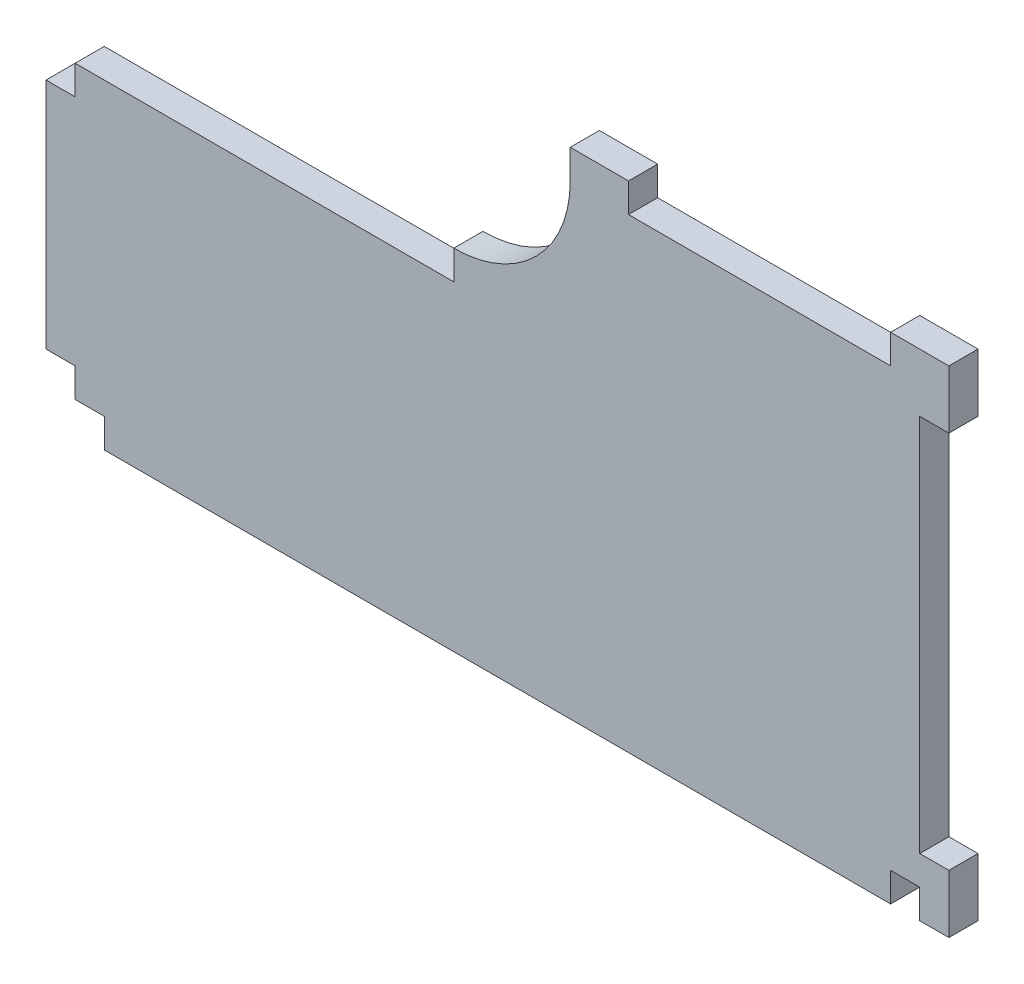
ISO-10303-21;
HEADER;
FILE_DESCRIPTION(('STEP AP214'),'2;1');
FILE_NAME('part.step','',(''),(''),'','','');
FILE_SCHEMA(('AUTOMOTIVE_DESIGN { 1 0 10303 214 1 1 1 1 }'));
ENDSEC;
DATA;
#1=APPLICATION_CONTEXT('core data for automotive mechanical design processes');
#2=APPLICATION_PROTOCOL_DEFINITION('international standard','automotive_design',2000,#1);
#3=PRODUCT_CONTEXT('',#1,'mechanical');
#4=PRODUCT('Part','Part','',(#3));
#5=PRODUCT_RELATED_PRODUCT_CATEGORY('part','',(#4));
#6=PRODUCT_DEFINITION_FORMATION('','',#4);
#7=PRODUCT_DEFINITION_CONTEXT('part definition',#1,'design');
#8=PRODUCT_DEFINITION('design','',#6,#7);
#9=PRODUCT_DEFINITION_SHAPE('','',#8);
#10=(LENGTH_UNIT() NAMED_UNIT(*) SI_UNIT(.MILLI.,.METRE.));
#11=(NAMED_UNIT(*) PLANE_ANGLE_UNIT() SI_UNIT($,.RADIAN.));
#12=(NAMED_UNIT(*) SI_UNIT($,.STERADIAN.) SOLID_ANGLE_UNIT());
#13=UNCERTAINTY_MEASURE_WITH_UNIT(LENGTH_MEASURE(1.E-05),#10,'distance_accuracy_value','');
#14=(GEOMETRIC_REPRESENTATION_CONTEXT(3) GLOBAL_UNCERTAINTY_ASSIGNED_CONTEXT((#13)) GLOBAL_UNIT_ASSIGNED_CONTEXT((#10,
#11,#12)) REPRESENTATION_CONTEXT('',''));
#15=CARTESIAN_POINT('',(0.,0.,0.));
#16=DIRECTION('',(0.,0.,1.));
#17=DIRECTION('',(1.,0.,0.));
#18=AXIS2_PLACEMENT_3D('',#15,#16,#17);
#19=CARTESIAN_POINT('',(-114.3,-6.35,-6.35));
#20=DIRECTION('',(0.,-1.,0.));
#21=DIRECTION('',(0.,0.,-1.));
#22=AXIS2_PLACEMENT_3D('',#19,#20,#21);
#23=PLANE('',#22);
#24=DIRECTION('',(0.,0.,1.));
#25=VECTOR('',#24,1.);
#26=CARTESIAN_POINT('',(-101.6,-6.35000000000002,-6.35));
#27=LINE('',#26,#25);
#28=CARTESIAN_POINT('',(-101.6,-6.35000000000002,-6.35));
#29=VERTEX_POINT('',#28);
#30=CARTESIAN_POINT('',(-101.6,-6.35,0.));
#31=VERTEX_POINT('',#30);
#32=EDGE_CURVE('E48',#29,#31,#27,.T.);
#33=ORIENTED_EDGE('',*,*,#32,.F.);
#34=DIRECTION('',(1.,0.,0.));
#35=VECTOR('',#34,1.);
#36=CARTESIAN_POINT('',(-114.3,-6.35,-6.35));
#37=LINE('',#36,#35);
#38=CARTESIAN_POINT('',(69.85,-6.35,-6.35));
#39=VERTEX_POINT('',#38);
#40=EDGE_CURVE('E219',#29,#39,#37,.T.);
#41=ORIENTED_EDGE('',*,*,#40,.T.);
#42=DIRECTION('',(0.,0.,1.));
#43=VECTOR('',#42,1.);
#44=CARTESIAN_POINT('',(69.85,-6.35,-6.35));
#45=LINE('',#44,#43);
#46=CARTESIAN_POINT('',(69.85,-6.35,0.));
#47=VERTEX_POINT('',#46);
#48=EDGE_CURVE('E392',#39,#47,#45,.T.);
#49=ORIENTED_EDGE('',*,*,#48,.T.);
#50=DIRECTION('',(1.,0.,0.));
#51=VECTOR('',#50,1.);
#52=CARTESIAN_POINT('',(-114.3,-6.35,0.));
#53=LINE('',#52,#51);
#54=EDGE_CURVE('E221',#31,#47,#53,.T.);
#55=ORIENTED_EDGE('',*,*,#54,.F.);
#56=EDGE_LOOP('',(#33,#41,#49,#55));
#57=FACE_BOUND('',#56,.T.);
#58=ADVANCED_FACE('F33',(#57),#23,.T.);
#59=CARTESIAN_POINT('',(82.55,-6.35,-6.35));
#60=DIRECTION('',(1.,0.,0.));
#61=DIRECTION('',(0.,0.,-1.));
#62=AXIS2_PLACEMENT_3D('',#59,#60,#61);
#63=PLANE('',#62);
#64=DIRECTION('',(0.,0.,1.));
#65=VECTOR('',#64,1.);
#66=CARTESIAN_POINT('',(82.55,88.9,-6.35));
#67=LINE('',#66,#65);
#68=CARTESIAN_POINT('',(82.55,88.9,-6.35));
#69=VERTEX_POINT('',#68);
#70=CARTESIAN_POINT('',(82.55,88.9,0.));
#71=VERTEX_POINT('',#70);
#72=EDGE_CURVE('E316',#69,#71,#67,.T.);
#73=ORIENTED_EDGE('',*,*,#72,.F.);
#74=DIRECTION('',(0.,1.,0.));
#75=VECTOR('',#74,1.);
#76=CARTESIAN_POINT('',(82.55,-6.35,-6.35));
#77=LINE('',#76,#75);
#78=CARTESIAN_POINT('',(82.55,101.6,-6.35));
#79=VERTEX_POINT('',#78);
#80=EDGE_CURVE('E230',#69,#79,#77,.T.);
#81=ORIENTED_EDGE('',*,*,#80,.T.);
#82=DIRECTION('',(0.,0.,1.));
#83=VECTOR('',#82,1.);
#84=CARTESIAN_POINT('',(82.55,101.6,-6.35));
#85=LINE('',#84,#83);
#86=CARTESIAN_POINT('',(82.55,101.6,0.));
#87=VERTEX_POINT('',#86);
#88=EDGE_CURVE('E11',#79,#87,#85,.T.);
#89=ORIENTED_EDGE('',*,*,#88,.T.);
#90=DIRECTION('',(0.,1.,0.));
#91=VECTOR('',#90,1.);
#92=CARTESIAN_POINT('',(82.55,-6.35,0.));
#93=LINE('',#92,#91);
#94=EDGE_CURVE('E250',#71,#87,#93,.T.);
#95=ORIENTED_EDGE('',*,*,#94,.F.);
#96=EDGE_LOOP('',(#73,#81,#89,#95));
#97=FACE_BOUND('',#96,.T.);
#98=ADVANCED_FACE('F371',(#97),#63,.T.);
#99=CARTESIAN_POINT('',(-114.3,101.6,-6.35));
#100=DIRECTION('',(0.,1.,0.));
#101=DIRECTION('',(0.,0.,1.));
#102=AXIS2_PLACEMENT_3D('',#99,#100,#101);
#103=PLANE('',#102);
#104=DIRECTION('',(0.,0.,1.));
#105=VECTOR('',#104,1.);
#106=CARTESIAN_POINT('',(69.85,101.6,-6.35));
#107=LINE('',#106,#105);
#108=CARTESIAN_POINT('',(69.85,101.6,-6.35));
#109=VERTEX_POINT('',#108);
#110=CARTESIAN_POINT('',(69.85,101.6,0.));
#111=VERTEX_POINT('',#110);
#112=EDGE_CURVE('E336',#109,#111,#107,.T.);
#113=ORIENTED_EDGE('',*,*,#112,.T.);
#114=DIRECTION('',(-1.,0.,0.));
#115=VECTOR('',#114,1.);
#116=CARTESIAN_POINT('',(-114.3,101.6,0.));
#117=LINE('',#116,#115);
#118=EDGE_CURVE('E255',#87,#111,#117,.T.);
#119=ORIENTED_EDGE('',*,*,#118,.F.);
#120=ORIENTED_EDGE('',*,*,#88,.F.);
#121=DIRECTION('',(-1.,0.,0.));
#122=VECTOR('',#121,1.);
#123=CARTESIAN_POINT('',(-114.3,101.6,-6.35));
#124=LINE('',#123,#122);
#125=EDGE_CURVE('E241',#79,#109,#124,.T.);
#126=ORIENTED_EDGE('',*,*,#125,.T.);
#127=EDGE_LOOP('',(#113,#119,#120,#126));
#128=FACE_BOUND('',#127,.T.);
#129=ADVANCED_FACE('F346',(#128),#103,.T.);
#130=CARTESIAN_POINT('',(-114.3,-6.35,-6.35));
#131=DIRECTION('',(-1.,0.,0.));
#132=DIRECTION('',(0.,0.,1.));
#133=AXIS2_PLACEMENT_3D('',#130,#131,#132);
#134=PLANE('',#133);
#135=DIRECTION('',(0.,0.,1.));
#136=VECTOR('',#135,1.);
#137=CARTESIAN_POINT('',(-114.3,6.35,-6.35));
#138=LINE('',#137,#136);
#139=CARTESIAN_POINT('',(-114.3,6.35,-6.35));
#140=VERTEX_POINT('',#139);
#141=CARTESIAN_POINT('',(-114.3,6.35,0.));
#142=VERTEX_POINT('',#141);
#143=EDGE_CURVE('E410',#140,#142,#138,.T.);
#144=ORIENTED_EDGE('',*,*,#143,.T.);
#145=DIRECTION('',(0.,-1.,0.));
#146=VECTOR('',#145,1.);
#147=CARTESIAN_POINT('',(-114.3,-6.35,0.));
#148=LINE('',#147,#146);
#149=CARTESIAN_POINT('',(-114.3,57.15,0.));
#150=VERTEX_POINT('',#149);
#151=EDGE_CURVE('E244',#150,#142,#148,.T.);
#152=ORIENTED_EDGE('',*,*,#151,.F.);
#153=DIRECTION('',(0.,0.,1.));
#154=VECTOR('',#153,1.);
#155=CARTESIAN_POINT('',(-114.3,57.15,-6.35));
#156=LINE('',#155,#154);
#157=CARTESIAN_POINT('',(-114.3,57.15,-6.35));
#158=VERTEX_POINT('',#157);
#159=EDGE_CURVE('E299',#158,#150,#156,.T.);
#160=ORIENTED_EDGE('',*,*,#159,.F.);
#161=DIRECTION('',(0.,-1.,0.));
#162=VECTOR('',#161,1.);
#163=CARTESIAN_POINT('',(-114.3,-6.35,-6.35));
#164=LINE('',#163,#162);
#165=EDGE_CURVE('E235',#158,#140,#164,.T.);
#166=ORIENTED_EDGE('',*,*,#165,.T.);
#167=EDGE_LOOP('',(#144,#152,#160,#166));
#168=FACE_BOUND('',#167,.T.);
#169=ADVANCED_FACE('F35',(#168),#134,.T.);
#170=DIRECTION('',(0.,0.,1.));
#171=VECTOR('',#170,1.);
#172=CARTESIAN_POINT('',(0.,101.6,-6.35));
#173=LINE('',#172,#171);
#174=CARTESIAN_POINT('',(0.,101.6,-6.35));
#175=VERTEX_POINT('',#174);
#176=CARTESIAN_POINT('',(0.,101.6,0.));
#177=VERTEX_POINT('',#176);
#178=EDGE_CURVE('E278',#175,#177,#173,.T.);
#179=ORIENTED_EDGE('',*,*,#178,.T.);
#180=CARTESIAN_POINT('',(12.7,101.6,0.));
#181=VERTEX_POINT('',#180);
#182=EDGE_CURVE('E254',#181,#177,#117,.T.);
#183=ORIENTED_EDGE('',*,*,#182,.F.);
#184=DIRECTION('',(0.,0.,1.));
#185=VECTOR('',#184,1.);
#186=CARTESIAN_POINT('',(12.7,101.6,-6.35));
#187=LINE('',#186,#185);
#188=CARTESIAN_POINT('',(12.7,101.6,-6.35));
#189=VERTEX_POINT('',#188);
#190=EDGE_CURVE('E276',#189,#181,#187,.T.);
#191=ORIENTED_EDGE('',*,*,#190,.F.);
#192=EDGE_CURVE('E240',#189,#175,#124,.T.);
#193=ORIENTED_EDGE('',*,*,#192,.T.);
#194=EDGE_LOOP('',(#179,#183,#191,#193));
#195=FACE_BOUND('',#194,.T.);
#196=ADVANCED_FACE('F274',(#195),#103,.T.);
#197=DIRECTION('',(0.,0.,1.));
#198=VECTOR('',#197,1.);
#199=CARTESIAN_POINT('',(82.55,6.35,-6.35));
#200=LINE('',#199,#198);
#201=CARTESIAN_POINT('',(82.55,6.35,-6.35));
#202=VERTEX_POINT('',#201);
#203=CARTESIAN_POINT('',(82.55,6.35,0.));
#204=VERTEX_POINT('',#203);
#205=EDGE_CURVE('E319',#202,#204,#200,.T.);
#206=ORIENTED_EDGE('',*,*,#205,.T.);
#207=CARTESIAN_POINT('',(82.55,-6.35,0.));
#208=VERTEX_POINT('',#207);
#209=EDGE_CURVE('E251',#208,#204,#93,.T.);
#210=ORIENTED_EDGE('',*,*,#209,.F.);
#211=DIRECTION('',(0.,0.,1.));
#212=VECTOR('',#211,1.);
#213=CARTESIAN_POINT('',(82.55,-6.35,-6.35));
#214=LINE('',#213,#212);
#215=CARTESIAN_POINT('',(82.55,-6.35,-6.35));
#216=VERTEX_POINT('',#215);
#217=EDGE_CURVE('E37',#216,#208,#214,.T.);
#218=ORIENTED_EDGE('',*,*,#217,.F.);
#219=EDGE_CURVE('E233',#216,#202,#77,.T.);
#220=ORIENTED_EDGE('',*,*,#219,.T.);
#221=EDGE_LOOP('',(#206,#210,#218,#220));
#222=FACE_BOUND('',#221,.T.);
#223=ADVANCED_FACE('F378',(#222),#63,.T.);
#224=DIRECTION('',(0.,0.,1.));
#225=VECTOR('',#224,1.);
#226=CARTESIAN_POINT('',(76.2,-6.35,-6.35));
#227=LINE('',#226,#225);
#228=CARTESIAN_POINT('',(76.2,-6.35,-6.35));
#229=VERTEX_POINT('',#228);
#230=CARTESIAN_POINT('',(76.2,-6.35,0.));
#231=VERTEX_POINT('',#230);
#232=EDGE_CURVE('E56',#229,#231,#227,.T.);
#233=ORIENTED_EDGE('',*,*,#232,.F.);
#234=EDGE_CURVE('E231',#229,#216,#37,.T.);
#235=ORIENTED_EDGE('',*,*,#234,.T.);
#236=ORIENTED_EDGE('',*,*,#217,.T.);
#237=EDGE_CURVE('E247',#231,#208,#53,.T.);
#238=ORIENTED_EDGE('',*,*,#237,.F.);
#239=EDGE_LOOP('',(#233,#235,#236,#238));
#240=FACE_BOUND('',#239,.T.);
#241=ADVANCED_FACE('F372',(#240),#23,.T.);
#242=CARTESIAN_POINT('',(0.,0.,-6.35));
#243=DIRECTION('',(0.,0.,-1.));
#244=DIRECTION('',(-1.,0.,0.));
#245=AXIS2_PLACEMENT_3D('',#242,#243,#244);
#246=PLANE('',#245);
#247=DIRECTION('',(-1.,0.,0.));
#248=VECTOR('',#247,1.);
#249=CARTESIAN_POINT('',(-114.3,6.35,-6.35));
#250=LINE('',#249,#248);
#251=CARTESIAN_POINT('',(-107.95,6.35,-6.35));
#252=VERTEX_POINT('',#251);
#253=EDGE_CURVE('E222',#252,#140,#250,.T.);
#254=ORIENTED_EDGE('',*,*,#253,.T.);
#255=ORIENTED_EDGE('',*,*,#165,.F.);
#256=DIRECTION('',(1.,0.,0.));
#257=VECTOR('',#256,1.);
#258=CARTESIAN_POINT('',(-114.3,57.15,-6.35));
#259=LINE('',#258,#257);
#260=CARTESIAN_POINT('',(-107.95,57.15,-6.35));
#261=VERTEX_POINT('',#260);
#262=EDGE_CURVE('E420',#158,#261,#259,.T.);
#263=ORIENTED_EDGE('',*,*,#262,.T.);
#264=DIRECTION('',(0.,1.,0.));
#265=VECTOR('',#264,1.);
#266=CARTESIAN_POINT('',(-107.95,63.5,-6.35));
#267=LINE('',#266,#265);
#268=CARTESIAN_POINT('',(-107.95,63.5,-6.35));
#269=VERTEX_POINT('',#268);
#270=EDGE_CURVE('E423',#261,#269,#267,.T.);
#271=ORIENTED_EDGE('',*,*,#270,.T.);
#272=DIRECTION('',(1.,0.,0.));
#273=VECTOR('',#272,1.);
#274=CARTESIAN_POINT('',(-25.4000000000002,63.5,-6.35));
#275=LINE('',#274,#273);
#276=CARTESIAN_POINT('',(-25.4000000000002,63.5,-6.35));
#277=VERTEX_POINT('',#276);
#278=EDGE_CURVE('E426',#269,#277,#275,.T.);
#279=ORIENTED_EDGE('',*,*,#278,.T.);
#280=DIRECTION('',(0.,1.,0.));
#281=VECTOR('',#280,1.);
#282=CARTESIAN_POINT('',(-25.4000000000002,69.85,-6.35));
#283=LINE('',#282,#281);
#284=CARTESIAN_POINT('',(-25.4000000000002,69.85,-6.35));
#285=VERTEX_POINT('',#284);
#286=EDGE_CURVE('E429',#277,#285,#283,.T.);
#287=ORIENTED_EDGE('',*,*,#286,.T.);
#288=CARTESIAN_POINT('',(-25.4,95.25,-6.35));
#289=DIRECTION('',(0.,0.,1.));
#290=DIRECTION('',(-1.,0.,0.));
#291=AXIS2_PLACEMENT_3D('',#288,#289,#290);
#292=CIRCLE('',#291,25.4);
#293=CARTESIAN_POINT('',(0.,95.2500000000002,-6.35));
#294=VERTEX_POINT('',#293);
#295=EDGE_CURVE('E432',#285,#294,#292,.T.);
#296=ORIENTED_EDGE('',*,*,#295,.T.);
#297=DIRECTION('',(0.,1.,0.));
#298=VECTOR('',#297,1.);
#299=CARTESIAN_POINT('',(0.,101.6,-6.35));
#300=LINE('',#299,#298);
#301=EDGE_CURVE('E301',#294,#175,#300,.T.);
#302=ORIENTED_EDGE('',*,*,#301,.T.);
#303=ORIENTED_EDGE('',*,*,#192,.F.);
#304=DIRECTION('',(0.,-1.,0.));
#305=VECTOR('',#304,1.);
#306=CARTESIAN_POINT('',(12.7,101.6,-6.35));
#307=LINE('',#306,#305);
#308=CARTESIAN_POINT('',(12.7,95.25,-6.35));
#309=VERTEX_POINT('',#308);
#310=EDGE_CURVE('E329',#189,#309,#307,.T.);
#311=ORIENTED_EDGE('',*,*,#310,.T.);
#312=DIRECTION('',(1.,0.,0.));
#313=VECTOR('',#312,1.);
#314=CARTESIAN_POINT('',(12.7,95.25,-6.35));
#315=LINE('',#314,#313);
#316=CARTESIAN_POINT('',(69.85,95.25,-6.35));
#317=VERTEX_POINT('',#316);
#318=EDGE_CURVE('E333',#309,#317,#315,.T.);
#319=ORIENTED_EDGE('',*,*,#318,.T.);
#320=DIRECTION('',(0.,1.,0.));
#321=VECTOR('',#320,1.);
#322=CARTESIAN_POINT('',(69.85,95.25,-6.35));
#323=LINE('',#322,#321);
#324=EDGE_CURVE('E326',#317,#109,#323,.T.);
#325=ORIENTED_EDGE('',*,*,#324,.T.);
#326=ORIENTED_EDGE('',*,*,#125,.F.);
#327=ORIENTED_EDGE('',*,*,#80,.F.);
#328=DIRECTION('',(-1.,0.,0.));
#329=VECTOR('',#328,1.);
#330=CARTESIAN_POINT('',(82.55,88.9,-6.35));
#331=LINE('',#330,#329);
#332=CARTESIAN_POINT('',(76.2,88.9,-6.35));
#333=VERTEX_POINT('',#332);
#334=EDGE_CURVE('E302',#69,#333,#331,.T.);
#335=ORIENTED_EDGE('',*,*,#334,.T.);
#336=DIRECTION('',(0.,-1.,0.));
#337=VECTOR('',#336,1.);
#338=CARTESIAN_POINT('',(76.2,88.9,-6.35));
#339=LINE('',#338,#337);
#340=CARTESIAN_POINT('',(76.2,6.35,-6.35));
#341=VERTEX_POINT('',#340);
#342=EDGE_CURVE('E305',#333,#341,#339,.T.);
#343=ORIENTED_EDGE('',*,*,#342,.T.);
#344=DIRECTION('',(1.,0.,0.));
#345=VECTOR('',#344,1.);
#346=CARTESIAN_POINT('',(76.2,6.35,-6.35));
#347=LINE('',#346,#345);
#348=EDGE_CURVE('E309',#341,#202,#347,.T.);
#349=ORIENTED_EDGE('',*,*,#348,.T.);
#350=ORIENTED_EDGE('',*,*,#219,.F.);
#351=ORIENTED_EDGE('',*,*,#234,.F.);
#352=DIRECTION('',(0.,1.,0.));
#353=VECTOR('',#352,1.);
#354=CARTESIAN_POINT('',(76.2,0.,-6.35));
#355=LINE('',#354,#353);
#356=CARTESIAN_POINT('',(76.2,0.,-6.35));
#357=VERTEX_POINT('',#356);
#358=EDGE_CURVE('E396',#229,#357,#355,.T.);
#359=ORIENTED_EDGE('',*,*,#358,.T.);
#360=DIRECTION('',(-1.,0.,0.));
#361=VECTOR('',#360,1.);
#362=CARTESIAN_POINT('',(76.2,0.,-6.35));
#363=LINE('',#362,#361);
#364=CARTESIAN_POINT('',(69.85,0.,-6.35));
#365=VERTEX_POINT('',#364);
#366=EDGE_CURVE('E419',#357,#365,#363,.T.);
#367=ORIENTED_EDGE('',*,*,#366,.T.);
#368=DIRECTION('',(0.,-1.,0.));
#369=VECTOR('',#368,1.);
#370=CARTESIAN_POINT('',(69.85,-6.35,-6.35));
#371=LINE('',#370,#369);
#372=EDGE_CURVE('E229',#365,#39,#371,.T.);
#373=ORIENTED_EDGE('',*,*,#372,.T.);
#374=ORIENTED_EDGE('',*,*,#40,.F.);
#375=DIRECTION('',(0.,1.,0.));
#376=VECTOR('',#375,1.);
#377=CARTESIAN_POINT('',(-101.6,-6.35000000000002,-6.35));
#378=LINE('',#377,#376);
#379=CARTESIAN_POINT('',(-101.6,0.,-6.35));
#380=VERTEX_POINT('',#379);
#381=EDGE_CURVE('E206',#29,#380,#378,.T.);
#382=ORIENTED_EDGE('',*,*,#381,.T.);
#383=DIRECTION('',(-1.,0.,0.));
#384=VECTOR('',#383,1.);
#385=CARTESIAN_POINT('',(-107.95,0.,-6.35));
#386=LINE('',#385,#384);
#387=CARTESIAN_POINT('',(-107.95,0.,-6.35));
#388=VERTEX_POINT('',#387);
#389=EDGE_CURVE('E213',#380,#388,#386,.T.);
#390=ORIENTED_EDGE('',*,*,#389,.T.);
#391=DIRECTION('',(0.,1.,0.));
#392=VECTOR('',#391,1.);
#393=CARTESIAN_POINT('',(-107.95,0.,-6.35));
#394=LINE('',#393,#392);
#395=EDGE_CURVE('E506',#388,#252,#394,.T.);
#396=ORIENTED_EDGE('',*,*,#395,.T.);
#397=EDGE_LOOP('',(#254,#255,#263,#271,#279,#287,#296,#302,#303,#311,#319,#325,#326,#327,#335,
#343,#349,#350,#351,#359,#367,#373,#374,#382,#390,#396));
#398=FACE_BOUND('',#397,.T.);
#399=ADVANCED_FACE('F226',(#398),#246,.T.);
#400=CARTESIAN_POINT('',(0.,0.,0.));
#401=DIRECTION('',(0.,0.,-1.));
#402=DIRECTION('',(-1.,0.,0.));
#403=AXIS2_PLACEMENT_3D('',#400,#401,#402);
#404=PLANE('',#403);
#405=ORIENTED_EDGE('',*,*,#151,.T.);
#406=DIRECTION('',(-1.,0.,0.));
#407=VECTOR('',#406,1.);
#408=CARTESIAN_POINT('',(-114.3,6.35,0.));
#409=LINE('',#408,#407);
#410=CARTESIAN_POINT('',(-107.95,6.35,0.));
#411=VERTEX_POINT('',#410);
#412=EDGE_CURVE('E214',#411,#142,#409,.T.);
#413=ORIENTED_EDGE('',*,*,#412,.F.);
#414=DIRECTION('',(0.,1.,0.));
#415=VECTOR('',#414,1.);
#416=CARTESIAN_POINT('',(-107.95,0.,0.));
#417=LINE('',#416,#415);
#418=CARTESIAN_POINT('',(-107.95,0.,0.));
#419=VERTEX_POINT('',#418);
#420=EDGE_CURVE('E496',#419,#411,#417,.T.);
#421=ORIENTED_EDGE('',*,*,#420,.F.);
#422=DIRECTION('',(-1.,0.,0.));
#423=VECTOR('',#422,1.);
#424=CARTESIAN_POINT('',(-107.95,0.,0.));
#425=LINE('',#424,#423);
#426=CARTESIAN_POINT('',(-101.6,0.,0.));
#427=VERTEX_POINT('',#426);
#428=EDGE_CURVE('E494',#427,#419,#425,.T.);
#429=ORIENTED_EDGE('',*,*,#428,.F.);
#430=DIRECTION('',(0.,1.,0.));
#431=VECTOR('',#430,1.);
#432=CARTESIAN_POINT('',(-101.6,-6.35000000000002,0.));
#433=LINE('',#432,#431);
#434=EDGE_CURVE('E491',#31,#427,#433,.T.);
#435=ORIENTED_EDGE('',*,*,#434,.F.);
#436=ORIENTED_EDGE('',*,*,#54,.T.);
#437=DIRECTION('',(0.,-1.,0.));
#438=VECTOR('',#437,1.);
#439=CARTESIAN_POINT('',(69.85,-6.35,0.));
#440=LINE('',#439,#438);
#441=CARTESIAN_POINT('',(69.85,0.,0.));
#442=VERTEX_POINT('',#441);
#443=EDGE_CURVE('E406',#442,#47,#440,.T.);
#444=ORIENTED_EDGE('',*,*,#443,.F.);
#445=DIRECTION('',(-1.,0.,0.));
#446=VECTOR('',#445,1.);
#447=CARTESIAN_POINT('',(76.2,0.,0.));
#448=LINE('',#447,#446);
#449=CARTESIAN_POINT('',(76.2,0.,0.));
#450=VERTEX_POINT('',#449);
#451=EDGE_CURVE('E405',#450,#442,#448,.T.);
#452=ORIENTED_EDGE('',*,*,#451,.F.);
#453=DIRECTION('',(0.,1.,0.));
#454=VECTOR('',#453,1.);
#455=CARTESIAN_POINT('',(76.2,0.,0.));
#456=LINE('',#455,#454);
#457=EDGE_CURVE('E402',#231,#450,#456,.T.);
#458=ORIENTED_EDGE('',*,*,#457,.F.);
#459=ORIENTED_EDGE('',*,*,#237,.T.);
#460=ORIENTED_EDGE('',*,*,#209,.T.);
#461=DIRECTION('',(1.,0.,0.));
#462=VECTOR('',#461,1.);
#463=CARTESIAN_POINT('',(76.2,6.35,0.));
#464=LINE('',#463,#462);
#465=CARTESIAN_POINT('',(76.2,6.35,0.));
#466=VERTEX_POINT('',#465);
#467=EDGE_CURVE('E306',#466,#204,#464,.T.);
#468=ORIENTED_EDGE('',*,*,#467,.F.);
#469=DIRECTION('',(0.,-1.,0.));
#470=VECTOR('',#469,1.);
#471=CARTESIAN_POINT('',(76.2,88.9,0.));
#472=LINE('',#471,#470);
#473=CARTESIAN_POINT('',(76.2,88.9,0.));
#474=VERTEX_POINT('',#473);
#475=EDGE_CURVE('E285',#474,#466,#472,.T.);
#476=ORIENTED_EDGE('',*,*,#475,.F.);
#477=DIRECTION('',(-1.,0.,0.));
#478=VECTOR('',#477,1.);
#479=CARTESIAN_POINT('',(82.55,88.9,0.));
#480=LINE('',#479,#478);
#481=EDGE_CURVE('E282',#71,#474,#480,.T.);
#482=ORIENTED_EDGE('',*,*,#481,.F.);
#483=ORIENTED_EDGE('',*,*,#94,.T.);
#484=ORIENTED_EDGE('',*,*,#118,.T.);
#485=DIRECTION('',(0.,1.,0.));
#486=VECTOR('',#485,1.);
#487=CARTESIAN_POINT('',(69.85,95.25,0.));
#488=LINE('',#487,#486);
#489=CARTESIAN_POINT('',(69.85,95.25,0.));
#490=VERTEX_POINT('',#489);
#491=EDGE_CURVE('E318',#490,#111,#488,.T.);
#492=ORIENTED_EDGE('',*,*,#491,.F.);
#493=DIRECTION('',(1.,0.,0.));
#494=VECTOR('',#493,1.);
#495=CARTESIAN_POINT('',(12.7,95.25,0.));
#496=LINE('',#495,#494);
#497=CARTESIAN_POINT('',(12.7,95.25,0.));
#498=VERTEX_POINT('',#497);
#499=EDGE_CURVE('E330',#498,#490,#496,.T.);
#500=ORIENTED_EDGE('',*,*,#499,.F.);
#501=DIRECTION('',(0.,-1.,0.));
#502=VECTOR('',#501,1.);
#503=CARTESIAN_POINT('',(12.7,101.6,0.));
#504=LINE('',#503,#502);
#505=EDGE_CURVE('E270',#181,#498,#504,.T.);
#506=ORIENTED_EDGE('',*,*,#505,.F.);
#507=ORIENTED_EDGE('',*,*,#182,.T.);
#508=DIRECTION('',(0.,1.,0.));
#509=VECTOR('',#508,1.);
#510=CARTESIAN_POINT('',(0.,101.6,0.));
#511=LINE('',#510,#509);
#512=CARTESIAN_POINT('',(0.,95.2500000000002,0.));
#513=VERTEX_POINT('',#512);
#514=EDGE_CURVE('E267',#513,#177,#511,.T.);
#515=ORIENTED_EDGE('',*,*,#514,.F.);
#516=CARTESIAN_POINT('',(-25.4,95.25,0.));
#517=DIRECTION('',(0.,0.,1.));
#518=DIRECTION('',(-1.,0.,0.));
#519=AXIS2_PLACEMENT_3D('',#516,#517,#518);
#520=CIRCLE('',#519,25.4);
#521=CARTESIAN_POINT('',(-25.4000000000002,69.85,0.));
#522=VERTEX_POINT('',#521);
#523=EDGE_CURVE('E446',#522,#513,#520,.T.);
#524=ORIENTED_EDGE('',*,*,#523,.F.);
#525=DIRECTION('',(0.,1.,0.));
#526=VECTOR('',#525,1.);
#527=CARTESIAN_POINT('',(-25.4000000000002,69.85,0.));
#528=LINE('',#527,#526);
#529=CARTESIAN_POINT('',(-25.4000000000002,63.5,0.));
#530=VERTEX_POINT('',#529);
#531=EDGE_CURVE('E444',#530,#522,#528,.T.);
#532=ORIENTED_EDGE('',*,*,#531,.F.);
#533=DIRECTION('',(1.,0.,0.));
#534=VECTOR('',#533,1.);
#535=CARTESIAN_POINT('',(-25.4000000000002,63.5,0.));
#536=LINE('',#535,#534);
#537=CARTESIAN_POINT('',(-107.95,63.5,0.));
#538=VERTEX_POINT('',#537);
#539=EDGE_CURVE('E441',#538,#530,#536,.T.);
#540=ORIENTED_EDGE('',*,*,#539,.F.);
#541=DIRECTION('',(0.,1.,0.));
#542=VECTOR('',#541,1.);
#543=CARTESIAN_POINT('',(-107.95,63.5,0.));
#544=LINE('',#543,#542);
#545=CARTESIAN_POINT('',(-107.95,57.15,0.));
#546=VERTEX_POINT('',#545);
#547=EDGE_CURVE('E438',#546,#538,#544,.T.);
#548=ORIENTED_EDGE('',*,*,#547,.F.);
#549=DIRECTION('',(1.,0.,0.));
#550=VECTOR('',#549,1.);
#551=CARTESIAN_POINT('',(-114.3,57.15,0.));
#552=LINE('',#551,#550);
#553=EDGE_CURVE('E416',#150,#546,#552,.T.);
#554=ORIENTED_EDGE('',*,*,#553,.F.);
#555=EDGE_LOOP('',(#405,#413,#421,#429,#435,#436,#444,#452,#458,#459,#460,#468,#476,#482,#483,
#484,#492,#500,#506,#507,#515,#524,#532,#540,#548,#554));
#556=FACE_BOUND('',#555,.T.);
#557=ADVANCED_FACE('F265',(#556),#404,.F.);
#558=CARTESIAN_POINT('',(69.85,95.25,-6.35));
#559=DIRECTION('',(1.,0.,0.));
#560=DIRECTION('',(0.,0.,-1.));
#561=AXIS2_PLACEMENT_3D('',#558,#559,#560);
#562=PLANE('',#561);
#563=ORIENTED_EDGE('',*,*,#491,.T.);
#564=ORIENTED_EDGE('',*,*,#112,.F.);
#565=ORIENTED_EDGE('',*,*,#324,.F.);
#566=DIRECTION('',(0.,0.,1.));
#567=VECTOR('',#566,1.);
#568=CARTESIAN_POINT('',(69.85,95.25,-6.35));
#569=LINE('',#568,#567);
#570=EDGE_CURVE('E248',#317,#490,#569,.T.);
#571=ORIENTED_EDGE('',*,*,#570,.T.);
#572=EDGE_LOOP('',(#563,#564,#565,#571));
#573=FACE_BOUND('',#572,.T.);
#574=ADVANCED_FACE('F351',(#573),#562,.F.);
#575=CARTESIAN_POINT('',(12.7,95.25,-6.35));
#576=DIRECTION('',(0.,-1.,0.));
#577=DIRECTION('',(0.,0.,-1.));
#578=AXIS2_PLACEMENT_3D('',#575,#576,#577);
#579=PLANE('',#578);
#580=ORIENTED_EDGE('',*,*,#499,.T.);
#581=ORIENTED_EDGE('',*,*,#570,.F.);
#582=ORIENTED_EDGE('',*,*,#318,.F.);
#583=DIRECTION('',(0.,0.,1.));
#584=VECTOR('',#583,1.);
#585=CARTESIAN_POINT('',(12.7,95.25,-6.35));
#586=LINE('',#585,#584);
#587=EDGE_CURVE('E342',#309,#498,#586,.T.);
#588=ORIENTED_EDGE('',*,*,#587,.T.);
#589=EDGE_LOOP('',(#580,#581,#582,#588));
#590=FACE_BOUND('',#589,.T.);
#591=ADVANCED_FACE('F355',(#590),#579,.F.);
#592=CARTESIAN_POINT('',(12.7,101.6,-6.35));
#593=DIRECTION('',(-1.,0.,0.));
#594=DIRECTION('',(0.,0.,1.));
#595=AXIS2_PLACEMENT_3D('',#592,#593,#594);
#596=PLANE('',#595);
#597=ORIENTED_EDGE('',*,*,#505,.T.);
#598=ORIENTED_EDGE('',*,*,#587,.F.);
#599=ORIENTED_EDGE('',*,*,#310,.F.);
#600=ORIENTED_EDGE('',*,*,#190,.T.);
#601=EDGE_LOOP('',(#597,#598,#599,#600));
#602=FACE_BOUND('',#601,.T.);
#603=ADVANCED_FACE('F357',(#602),#596,.F.);
#604=CARTESIAN_POINT('',(82.55,88.9,-6.35));
#605=DIRECTION('',(0.,1.,0.));
#606=DIRECTION('',(0.,0.,1.));
#607=AXIS2_PLACEMENT_3D('',#604,#605,#606);
#608=PLANE('',#607);
#609=ORIENTED_EDGE('',*,*,#481,.T.);
#610=DIRECTION('',(0.,0.,1.));
#611=VECTOR('',#610,1.);
#612=CARTESIAN_POINT('',(76.2,88.9,-6.35));
#613=LINE('',#612,#611);
#614=EDGE_CURVE('E311',#333,#474,#613,.T.);
#615=ORIENTED_EDGE('',*,*,#614,.F.);
#616=ORIENTED_EDGE('',*,*,#334,.F.);
#617=ORIENTED_EDGE('',*,*,#72,.T.);
#618=EDGE_LOOP('',(#609,#615,#616,#617));
#619=FACE_BOUND('',#618,.T.);
#620=ADVANCED_FACE('F359',(#619),#608,.F.);
#621=CARTESIAN_POINT('',(76.2,6.35,-6.35));
#622=DIRECTION('',(0.,-1.,0.));
#623=DIRECTION('',(0.,0.,-1.));
#624=AXIS2_PLACEMENT_3D('',#621,#622,#623);
#625=PLANE('',#624);
#626=ORIENTED_EDGE('',*,*,#467,.T.);
#627=ORIENTED_EDGE('',*,*,#205,.F.);
#628=ORIENTED_EDGE('',*,*,#348,.F.);
#629=DIRECTION('',(0.,0.,1.));
#630=VECTOR('',#629,1.);
#631=CARTESIAN_POINT('',(76.2,6.35,-6.35));
#632=LINE('',#631,#630);
#633=EDGE_CURVE('E322',#341,#466,#632,.T.);
#634=ORIENTED_EDGE('',*,*,#633,.T.);
#635=EDGE_LOOP('',(#626,#627,#628,#634));
#636=FACE_BOUND('',#635,.T.);
#637=ADVANCED_FACE('F365',(#636),#625,.F.);
#638=CARTESIAN_POINT('',(76.2,88.9,-6.35));
#639=DIRECTION('',(-1.,0.,0.));
#640=DIRECTION('',(0.,0.,1.));
#641=AXIS2_PLACEMENT_3D('',#638,#639,#640);
#642=PLANE('',#641);
#643=ORIENTED_EDGE('',*,*,#475,.T.);
#644=ORIENTED_EDGE('',*,*,#633,.F.);
#645=ORIENTED_EDGE('',*,*,#342,.F.);
#646=ORIENTED_EDGE('',*,*,#614,.T.);
#647=EDGE_LOOP('',(#643,#644,#645,#646));
#648=FACE_BOUND('',#647,.T.);
#649=ADVANCED_FACE('F529',(#648),#642,.F.);
#650=CARTESIAN_POINT('',(0.,101.6,-6.35));
#651=DIRECTION('',(1.,0.,0.));
#652=DIRECTION('',(0.,1.,0.));
#653=AXIS2_PLACEMENT_3D('',#650,#651,#652);
#654=PLANE('',#653);
#655=ORIENTED_EDGE('',*,*,#514,.T.);
#656=ORIENTED_EDGE('',*,*,#178,.F.);
#657=ORIENTED_EDGE('',*,*,#301,.F.);
#658=DIRECTION('',(0.,0.,1.));
#659=VECTOR('',#658,1.);
#660=CARTESIAN_POINT('',(0.,95.2500000000002,-6.35));
#661=LINE('',#660,#659);
#662=EDGE_CURVE('E283',#294,#513,#661,.T.);
#663=ORIENTED_EDGE('',*,*,#662,.T.);
#664=EDGE_LOOP('',(#655,#656,#657,#663));
#665=FACE_BOUND('',#664,.T.);
#666=ADVANCED_FACE('F449',(#665),#654,.F.);
#667=CARTESIAN_POINT('',(-25.4,95.25,-6.35));
#668=DIRECTION('',(0.,0.,1.));
#669=DIRECTION('',(1.,0.,0.));
#670=AXIS2_PLACEMENT_3D('',#667,#668,#669);
#671=CYLINDRICAL_SURFACE('',#670,25.4);
#672=ORIENTED_EDGE('',*,*,#523,.T.);
#673=ORIENTED_EDGE('',*,*,#662,.F.);
#674=ORIENTED_EDGE('',*,*,#295,.F.);
#675=DIRECTION('',(0.,0.,1.));
#676=VECTOR('',#675,1.);
#677=CARTESIAN_POINT('',(-25.4000000000002,69.85,-6.35));
#678=LINE('',#677,#676);
#679=EDGE_CURVE('E287',#285,#522,#678,.T.);
#680=ORIENTED_EDGE('',*,*,#679,.T.);
#681=EDGE_LOOP('',(#672,#673,#674,#680));
#682=FACE_BOUND('',#681,.T.);
#683=ADVANCED_FACE('F451',(#682),#671,.F.);
#684=CARTESIAN_POINT('',(-25.4000000000002,69.85,-6.35));
#685=DIRECTION('',(1.,0.,0.));
#686=DIRECTION('',(0.,1.,0.));
#687=AXIS2_PLACEMENT_3D('',#684,#685,#686);
#688=PLANE('',#687);
#689=ORIENTED_EDGE('',*,*,#531,.T.);
#690=ORIENTED_EDGE('',*,*,#679,.F.);
#691=ORIENTED_EDGE('',*,*,#286,.F.);
#692=DIRECTION('',(0.,0.,1.));
#693=VECTOR('',#692,1.);
#694=CARTESIAN_POINT('',(-25.4000000000002,63.5,-6.35));
#695=LINE('',#694,#693);
#696=EDGE_CURVE('E293',#277,#530,#695,.T.);
#697=ORIENTED_EDGE('',*,*,#696,.T.);
#698=EDGE_LOOP('',(#689,#690,#691,#697));
#699=FACE_BOUND('',#698,.T.);
#700=ADVANCED_FACE('F455',(#699),#688,.F.);
#701=CARTESIAN_POINT('',(-25.4000000000002,63.5,-6.35));
#702=DIRECTION('',(0.,-1.,0.));
#703=DIRECTION('',(0.,0.,-1.));
#704=AXIS2_PLACEMENT_3D('',#701,#702,#703);
#705=PLANE('',#704);
#706=ORIENTED_EDGE('',*,*,#539,.T.);
#707=ORIENTED_EDGE('',*,*,#696,.F.);
#708=ORIENTED_EDGE('',*,*,#278,.F.);
#709=DIRECTION('',(0.,0.,1.));
#710=VECTOR('',#709,1.);
#711=CARTESIAN_POINT('',(-107.95,63.5,-6.35));
#712=LINE('',#711,#710);
#713=EDGE_CURVE('E295',#269,#538,#712,.T.);
#714=ORIENTED_EDGE('',*,*,#713,.T.);
#715=EDGE_LOOP('',(#706,#707,#708,#714));
#716=FACE_BOUND('',#715,.T.);
#717=ADVANCED_FACE('F461',(#716),#705,.F.);
#718=CARTESIAN_POINT('',(-107.95,63.5,-6.35));
#719=DIRECTION('',(1.,0.,0.));
#720=DIRECTION('',(0.,0.,-1.));
#721=AXIS2_PLACEMENT_3D('',#718,#719,#720);
#722=PLANE('',#721);
#723=ORIENTED_EDGE('',*,*,#547,.T.);
#724=ORIENTED_EDGE('',*,*,#713,.F.);
#725=ORIENTED_EDGE('',*,*,#270,.F.);
#726=DIRECTION('',(0.,0.,1.));
#727=VECTOR('',#726,1.);
#728=CARTESIAN_POINT('',(-107.95,57.15,-6.35));
#729=LINE('',#728,#727);
#730=EDGE_CURVE('E297',#261,#546,#729,.T.);
#731=ORIENTED_EDGE('',*,*,#730,.T.);
#732=EDGE_LOOP('',(#723,#724,#725,#731));
#733=FACE_BOUND('',#732,.T.);
#734=ADVANCED_FACE('F464',(#733),#722,.F.);
#735=CARTESIAN_POINT('',(-114.3,57.15,-6.35));
#736=DIRECTION('',(0.,-1.,0.));
#737=DIRECTION('',(0.,0.,-1.));
#738=AXIS2_PLACEMENT_3D('',#735,#736,#737);
#739=PLANE('',#738);
#740=ORIENTED_EDGE('',*,*,#553,.T.);
#741=ORIENTED_EDGE('',*,*,#730,.F.);
#742=ORIENTED_EDGE('',*,*,#262,.F.);
#743=ORIENTED_EDGE('',*,*,#159,.T.);
#744=EDGE_LOOP('',(#740,#741,#742,#743));
#745=FACE_BOUND('',#744,.T.);
#746=ADVANCED_FACE('F466',(#745),#739,.F.);
#747=CARTESIAN_POINT('',(69.85,-6.35,-6.35));
#748=DIRECTION('',(-1.,0.,0.));
#749=DIRECTION('',(0.,0.,1.));
#750=AXIS2_PLACEMENT_3D('',#747,#748,#749);
#751=PLANE('',#750);
#752=ORIENTED_EDGE('',*,*,#443,.T.);
#753=ORIENTED_EDGE('',*,*,#48,.F.);
#754=ORIENTED_EDGE('',*,*,#372,.F.);
#755=DIRECTION('',(0.,0.,1.));
#756=VECTOR('',#755,1.);
#757=CARTESIAN_POINT('',(69.85,0.,-6.35));
#758=LINE('',#757,#756);
#759=EDGE_CURVE('E414',#365,#442,#758,.T.);
#760=ORIENTED_EDGE('',*,*,#759,.T.);
#761=EDGE_LOOP('',(#752,#753,#754,#760));
#762=FACE_BOUND('',#761,.T.);
#763=ADVANCED_FACE('F489',(#762),#751,.F.);
#764=CARTESIAN_POINT('',(76.2,0.,-6.35));
#765=DIRECTION('',(0.,1.,0.));
#766=DIRECTION('',(0.,0.,1.));
#767=AXIS2_PLACEMENT_3D('',#764,#765,#766);
#768=PLANE('',#767);
#769=ORIENTED_EDGE('',*,*,#451,.T.);
#770=ORIENTED_EDGE('',*,*,#759,.F.);
#771=ORIENTED_EDGE('',*,*,#366,.F.);
#772=DIRECTION('',(0.,0.,1.));
#773=VECTOR('',#772,1.);
#774=CARTESIAN_POINT('',(76.2,0.,-6.35));
#775=LINE('',#774,#773);
#776=EDGE_CURVE('E391',#357,#450,#775,.T.);
#777=ORIENTED_EDGE('',*,*,#776,.T.);
#778=EDGE_LOOP('',(#769,#770,#771,#777));
#779=FACE_BOUND('',#778,.T.);
#780=ADVANCED_FACE('F487',(#779),#768,.F.);
#781=CARTESIAN_POINT('',(76.2,0.,-6.35));
#782=DIRECTION('',(1.,0.,0.));
#783=DIRECTION('',(0.,0.,-1.));
#784=AXIS2_PLACEMENT_3D('',#781,#782,#783);
#785=PLANE('',#784);
#786=ORIENTED_EDGE('',*,*,#457,.T.);
#787=ORIENTED_EDGE('',*,*,#776,.F.);
#788=ORIENTED_EDGE('',*,*,#358,.F.);
#789=ORIENTED_EDGE('',*,*,#232,.T.);
#790=EDGE_LOOP('',(#786,#787,#788,#789));
#791=FACE_BOUND('',#790,.T.);
#792=ADVANCED_FACE('F522',(#791),#785,.F.);
#793=CARTESIAN_POINT('',(-114.3,6.35,-6.35));
#794=DIRECTION('',(0.,1.,0.));
#795=DIRECTION('',(0.,0.,1.));
#796=AXIS2_PLACEMENT_3D('',#793,#794,#795);
#797=PLANE('',#796);
#798=ORIENTED_EDGE('',*,*,#412,.T.);
#799=ORIENTED_EDGE('',*,*,#143,.F.);
#800=ORIENTED_EDGE('',*,*,#253,.F.);
#801=DIRECTION('',(0.,0.,1.));
#802=VECTOR('',#801,1.);
#803=CARTESIAN_POINT('',(-107.95,6.35,-6.35));
#804=LINE('',#803,#802);
#805=EDGE_CURVE('E475',#252,#411,#804,.T.);
#806=ORIENTED_EDGE('',*,*,#805,.T.);
#807=EDGE_LOOP('',(#798,#799,#800,#806));
#808=FACE_BOUND('',#807,.T.);
#809=ADVANCED_FACE('F502',(#808),#797,.F.);
#810=CARTESIAN_POINT('',(-107.95,0.,-6.35));
#811=DIRECTION('',(1.,0.,0.));
#812=DIRECTION('',(0.,0.,-1.));
#813=AXIS2_PLACEMENT_3D('',#810,#811,#812);
#814=PLANE('',#813);
#815=ORIENTED_EDGE('',*,*,#420,.T.);
#816=ORIENTED_EDGE('',*,*,#805,.F.);
#817=ORIENTED_EDGE('',*,*,#395,.F.);
#818=DIRECTION('',(0.,0.,1.));
#819=VECTOR('',#818,1.);
#820=CARTESIAN_POINT('',(-107.95,0.,-6.35));
#821=LINE('',#820,#819);
#822=EDGE_CURVE('E477',#388,#419,#821,.T.);
#823=ORIENTED_EDGE('',*,*,#822,.T.);
#824=EDGE_LOOP('',(#815,#816,#817,#823));
#825=FACE_BOUND('',#824,.T.);
#826=ADVANCED_FACE('F505',(#825),#814,.F.);
#827=CARTESIAN_POINT('',(-107.95,0.,-6.35));
#828=DIRECTION('',(0.,1.,0.));
#829=DIRECTION('',(0.,0.,1.));
#830=AXIS2_PLACEMENT_3D('',#827,#828,#829);
#831=PLANE('',#830);
#832=ORIENTED_EDGE('',*,*,#428,.T.);
#833=ORIENTED_EDGE('',*,*,#822,.F.);
#834=ORIENTED_EDGE('',*,*,#389,.F.);
#835=DIRECTION('',(0.,0.,1.));
#836=VECTOR('',#835,1.);
#837=CARTESIAN_POINT('',(-101.6,0.,-6.35));
#838=LINE('',#837,#836);
#839=EDGE_CURVE('E208',#380,#427,#838,.T.);
#840=ORIENTED_EDGE('',*,*,#839,.T.);
#841=EDGE_LOOP('',(#832,#833,#834,#840));
#842=FACE_BOUND('',#841,.T.);
#843=ADVANCED_FACE('F509',(#842),#831,.F.);
#844=CARTESIAN_POINT('',(-101.6,-6.35000000000002,-6.35));
#845=DIRECTION('',(1.,0.,0.));
#846=DIRECTION('',(0.,1.,0.));
#847=AXIS2_PLACEMENT_3D('',#844,#845,#846);
#848=PLANE('',#847);
#849=ORIENTED_EDGE('',*,*,#434,.T.);
#850=ORIENTED_EDGE('',*,*,#839,.F.);
#851=ORIENTED_EDGE('',*,*,#381,.F.);
#852=ORIENTED_EDGE('',*,*,#32,.T.);
#853=EDGE_LOOP('',(#849,#850,#851,#852));
#854=FACE_BOUND('',#853,.T.);
#855=ADVANCED_FACE('F207',(#854),#848,.F.);
#856=CLOSED_SHELL('',(#58,#98,#129,#169,#196,#223,#241,#399,#557,#574,#591,#603,#620,#637,#649,
#666,#683,#700,#717,#734,#746,#763,#780,#792,#809,#826,#843,#855));
#857=MANIFOLD_SOLID_BREP('B2',#856);
#858=ADVANCED_BREP_SHAPE_REPRESENTATION('',(#18,#857),#14);
#859=SHAPE_DEFINITION_REPRESENTATION(#9,#858);
ENDSEC;
END-ISO-10303-21;
